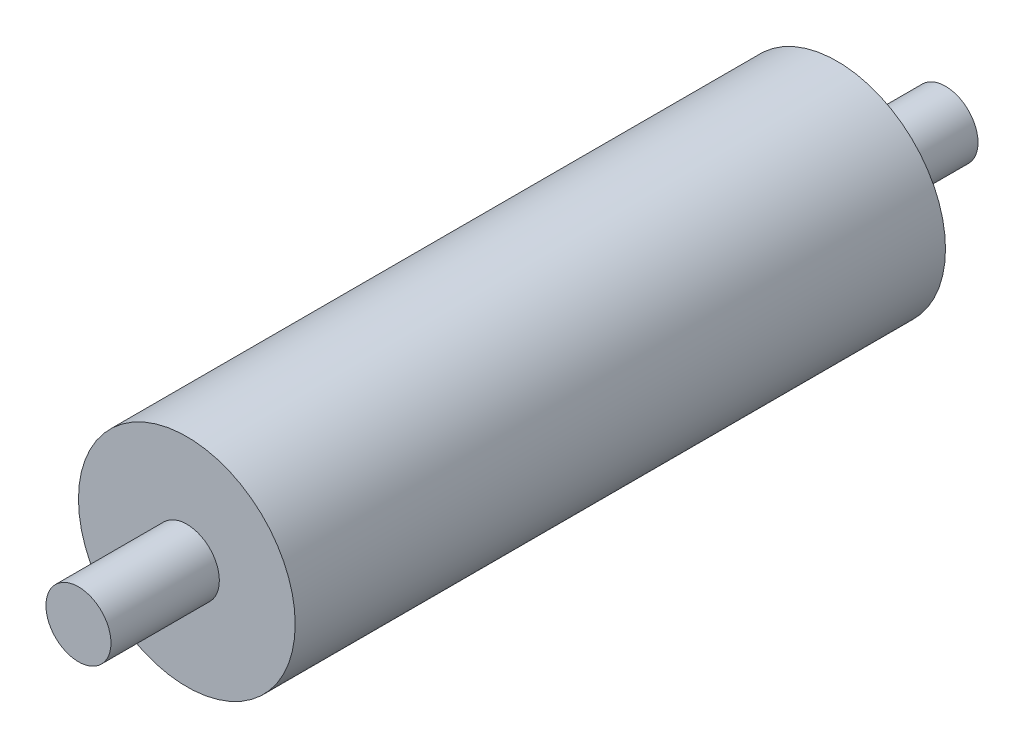
ISO-10303-21;
HEADER;
FILE_DESCRIPTION(('STEP AP214'),'2;1');
FILE_NAME('part.step','',(''),(''),'','','');
FILE_SCHEMA(('AUTOMOTIVE_DESIGN { 1 0 10303 214 1 1 1 1 }'));
ENDSEC;
DATA;
#1=APPLICATION_CONTEXT('core data for automotive mechanical design processes');
#2=APPLICATION_PROTOCOL_DEFINITION('international standard','automotive_design',2000,#1);
#3=PRODUCT_CONTEXT('',#1,'mechanical');
#4=PRODUCT('Part','Part','',(#3));
#5=PRODUCT_RELATED_PRODUCT_CATEGORY('part','',(#4));
#6=PRODUCT_DEFINITION_FORMATION('','',#4);
#7=PRODUCT_DEFINITION_CONTEXT('part definition',#1,'design');
#8=PRODUCT_DEFINITION('design','',#6,#7);
#9=PRODUCT_DEFINITION_SHAPE('','',#8);
#10=(LENGTH_UNIT() NAMED_UNIT(*) SI_UNIT(.MILLI.,.METRE.));
#11=(NAMED_UNIT(*) PLANE_ANGLE_UNIT() SI_UNIT($,.RADIAN.));
#12=(NAMED_UNIT(*) SI_UNIT($,.STERADIAN.) SOLID_ANGLE_UNIT());
#13=UNCERTAINTY_MEASURE_WITH_UNIT(LENGTH_MEASURE(1.E-05),#10,'distance_accuracy_value','');
#14=(GEOMETRIC_REPRESENTATION_CONTEXT(3) GLOBAL_UNCERTAINTY_ASSIGNED_CONTEXT((#13)) GLOBAL_UNIT_ASSIGNED_CONTEXT((#10,
#11,#12)) REPRESENTATION_CONTEXT('',''));
#15=CARTESIAN_POINT('',(0.,0.,0.));
#16=DIRECTION('',(0.,0.,1.));
#17=DIRECTION('',(1.,0.,0.));
#18=AXIS2_PLACEMENT_3D('',#15,#16,#17);
#19=CARTESIAN_POINT('',(0.,0.,300.));
#20=DIRECTION('',(0.,0.,-1.));
#21=DIRECTION('',(-1.,0.,0.));
#22=AXIS2_PLACEMENT_3D('',#19,#20,#21);
#23=CYLINDRICAL_SURFACE('',#22,50.);
#24=CARTESIAN_POINT('',(0.,0.,300.));
#25=DIRECTION('',(0.,0.,1.));
#26=DIRECTION('',(1.,0.,0.));
#27=AXIS2_PLACEMENT_3D('',#24,#25,#26);
#28=CIRCLE('',#27,50.);
#29=CARTESIAN_POINT('',(50.,0.,300.));
#30=VERTEX_POINT('',#29);
#31=EDGE_CURVE('E42',#30,#30,#28,.T.);
#32=ORIENTED_EDGE('',*,*,#31,.F.);
#33=EDGE_LOOP('',(#32));
#34=FACE_BOUND('',#33,.T.);
#35=CARTESIAN_POINT('',(0.,0.,0.));
#36=DIRECTION('',(0.,0.,1.));
#37=DIRECTION('',(1.,0.,0.));
#38=AXIS2_PLACEMENT_3D('',#35,#36,#37);
#39=CIRCLE('',#38,50.);
#40=CARTESIAN_POINT('',(50.,0.,0.));
#41=VERTEX_POINT('',#40);
#42=EDGE_CURVE('E38',#41,#41,#39,.T.);
#43=ORIENTED_EDGE('',*,*,#42,.T.);
#44=EDGE_LOOP('',(#43));
#45=FACE_BOUND('',#44,.T.);
#46=ADVANCED_FACE('F35',(#34,#45),#23,.T.);
#47=CARTESIAN_POINT('',(0.,0.,300.));
#48=DIRECTION('',(0.,0.,1.));
#49=DIRECTION('',(1.,0.,0.));
#50=AXIS2_PLACEMENT_3D('',#47,#48,#49);
#51=PLANE('',#50);
#52=CARTESIAN_POINT('',(0.,0.,300.));
#53=DIRECTION('',(0.,0.,1.));
#54=DIRECTION('',(1.,0.,0.));
#55=AXIS2_PLACEMENT_3D('',#52,#53,#54);
#56=CIRCLE('',#55,15.);
#57=CARTESIAN_POINT('',(15.,0.,300.));
#58=VERTEX_POINT('',#57);
#59=EDGE_CURVE('E10',#58,#58,#56,.T.);
#60=ORIENTED_EDGE('',*,*,#59,.F.);
#61=EDGE_LOOP('',(#60));
#62=FACE_BOUND('',#61,.T.);
#63=ORIENTED_EDGE('',*,*,#31,.T.);
#64=EDGE_LOOP('',(#63));
#65=FACE_BOUND('',#64,.T.);
#66=ADVANCED_FACE('F74',(#62,#65),#51,.T.);
#67=CARTESIAN_POINT('',(0.,0.,0.));
#68=DIRECTION('',(0.,0.,1.));
#69=DIRECTION('',(1.,0.,0.));
#70=AXIS2_PLACEMENT_3D('',#67,#68,#69);
#71=PLANE('',#70);
#72=CARTESIAN_POINT('',(0.,0.,0.));
#73=DIRECTION('',(0.,0.,1.));
#74=DIRECTION('',(1.,0.,0.));
#75=AXIS2_PLACEMENT_3D('',#72,#73,#74);
#76=CIRCLE('',#75,15.);
#77=CARTESIAN_POINT('',(15.,0.,0.));
#78=VERTEX_POINT('',#77);
#79=EDGE_CURVE('E51',#78,#78,#76,.T.);
#80=ORIENTED_EDGE('',*,*,#79,.T.);
#81=EDGE_LOOP('',(#80));
#82=FACE_BOUND('',#81,.T.);
#83=ORIENTED_EDGE('',*,*,#42,.F.);
#84=EDGE_LOOP('',(#83));
#85=FACE_BOUND('',#84,.T.);
#86=ADVANCED_FACE('F58',(#82,#85),#71,.F.);
#87=CARTESIAN_POINT('',(0.,0.,350.));
#88=DIRECTION('',(0.,0.,-1.));
#89=DIRECTION('',(-1.,0.,0.));
#90=AXIS2_PLACEMENT_3D('',#87,#88,#89);
#91=CYLINDRICAL_SURFACE('',#90,15.);
#92=CARTESIAN_POINT('',(0.,0.,350.));
#93=DIRECTION('',(0.,0.,1.));
#94=DIRECTION('',(1.,0.,0.));
#95=AXIS2_PLACEMENT_3D('',#92,#93,#94);
#96=CIRCLE('',#95,15.);
#97=CARTESIAN_POINT('',(15.,0.,350.));
#98=VERTEX_POINT('',#97);
#99=EDGE_CURVE('E48',#98,#98,#96,.T.);
#100=ORIENTED_EDGE('',*,*,#99,.F.);
#101=EDGE_LOOP('',(#100));
#102=FACE_BOUND('',#101,.T.);
#103=ORIENTED_EDGE('',*,*,#59,.T.);
#104=EDGE_LOOP('',(#103));
#105=FACE_BOUND('',#104,.T.);
#106=ADVANCED_FACE('F86',(#102,#105),#91,.T.);
#107=CARTESIAN_POINT('',(0.,0.,350.));
#108=DIRECTION('',(0.,0.,1.));
#109=DIRECTION('',(1.,0.,0.));
#110=AXIS2_PLACEMENT_3D('',#107,#108,#109);
#111=PLANE('',#110);
#112=ORIENTED_EDGE('',*,*,#99,.T.);
#113=EDGE_LOOP('',(#112));
#114=FACE_BOUND('',#113,.T.);
#115=ADVANCED_FACE('F65',(#114),#111,.T.);
#116=CARTESIAN_POINT('',(0.,0.,0.));
#117=DIRECTION('',(0.,0.,-1.));
#118=DIRECTION('',(-1.,0.,0.));
#119=AXIS2_PLACEMENT_3D('',#116,#117,#118);
#120=CYLINDRICAL_SURFACE('',#119,15.);
#121=ORIENTED_EDGE('',*,*,#79,.F.);
#122=EDGE_LOOP('',(#121));
#123=FACE_BOUND('',#122,.T.);
#124=CARTESIAN_POINT('',(0.,0.,-50.));
#125=DIRECTION('',(0.,0.,1.));
#126=DIRECTION('',(1.,0.,0.));
#127=AXIS2_PLACEMENT_3D('',#124,#125,#126);
#128=CIRCLE('',#127,15.);
#129=CARTESIAN_POINT('',(15.,0.,-50.));
#130=VERTEX_POINT('',#129);
#131=EDGE_CURVE('E52',#130,#130,#128,.T.);
#132=ORIENTED_EDGE('',*,*,#131,.T.);
#133=EDGE_LOOP('',(#132));
#134=FACE_BOUND('',#133,.T.);
#135=ADVANCED_FACE('F61',(#123,#134),#120,.T.);
#136=CARTESIAN_POINT('',(0.,0.,-50.));
#137=DIRECTION('',(0.,0.,1.));
#138=DIRECTION('',(1.,0.,0.));
#139=AXIS2_PLACEMENT_3D('',#136,#137,#138);
#140=PLANE('',#139);
#141=ORIENTED_EDGE('',*,*,#131,.F.);
#142=EDGE_LOOP('',(#141));
#143=FACE_BOUND('',#142,.T.);
#144=ADVANCED_FACE('F64',(#143),#140,.F.);
#145=CLOSED_SHELL('',(#46,#66,#86,#106,#115,#135,#144));
#146=MANIFOLD_SOLID_BREP('B2',#145);
#147=ADVANCED_BREP_SHAPE_REPRESENTATION('',(#18,#146),#14);
#148=SHAPE_DEFINITION_REPRESENTATION(#9,#147);
ENDSEC;
END-ISO-10303-21;
